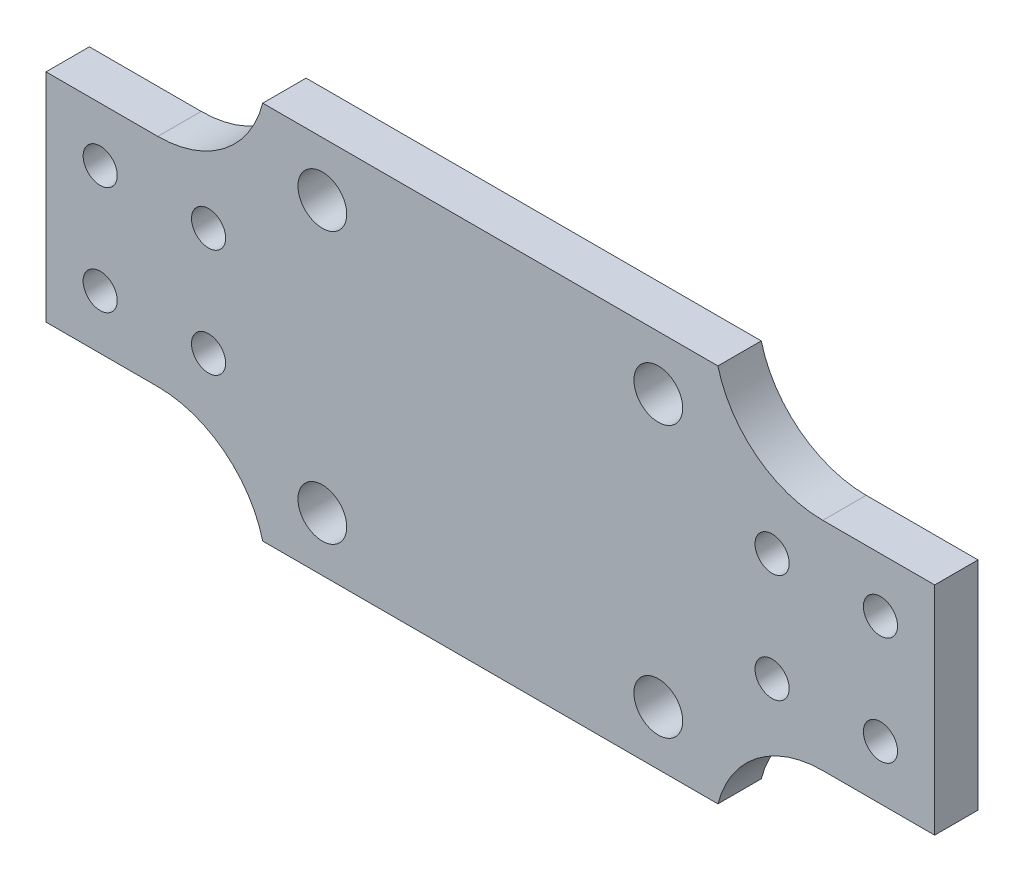
ISO-10303-21;
HEADER;
FILE_DESCRIPTION(('STEP AP214'),'2;1');
FILE_NAME('part.step','',(''),(''),'','','');
FILE_SCHEMA(('AUTOMOTIVE_DESIGN { 1 0 10303 214 1 1 1 1 }'));
ENDSEC;
DATA;
#1=APPLICATION_CONTEXT('core data for automotive mechanical design processes');
#2=APPLICATION_PROTOCOL_DEFINITION('international standard','automotive_design',2000,#1);
#3=PRODUCT_CONTEXT('',#1,'mechanical');
#4=PRODUCT('Part','Part','',(#3));
#5=PRODUCT_RELATED_PRODUCT_CATEGORY('part','',(#4));
#6=PRODUCT_DEFINITION_FORMATION('','',#4);
#7=PRODUCT_DEFINITION_CONTEXT('part definition',#1,'design');
#8=PRODUCT_DEFINITION('design','',#6,#7);
#9=PRODUCT_DEFINITION_SHAPE('','',#8);
#10=(LENGTH_UNIT() NAMED_UNIT(*) SI_UNIT(.MILLI.,.METRE.));
#11=(NAMED_UNIT(*) PLANE_ANGLE_UNIT() SI_UNIT($,.RADIAN.));
#12=(NAMED_UNIT(*) SI_UNIT($,.STERADIAN.) SOLID_ANGLE_UNIT());
#13=UNCERTAINTY_MEASURE_WITH_UNIT(LENGTH_MEASURE(1.E-05),#10,'distance_accuracy_value','');
#14=(GEOMETRIC_REPRESENTATION_CONTEXT(3) GLOBAL_UNCERTAINTY_ASSIGNED_CONTEXT((#13)) GLOBAL_UNIT_ASSIGNED_CONTEXT((#10,
#11,#12)) REPRESENTATION_CONTEXT('',''));
#15=CARTESIAN_POINT('',(0.,0.,0.));
#16=DIRECTION('',(0.,0.,1.));
#17=DIRECTION('',(1.,0.,0.));
#18=AXIS2_PLACEMENT_3D('',#15,#16,#17);
#19=CARTESIAN_POINT('',(0.,-20.,4.));
#20=DIRECTION('',(0.,1.,0.));
#21=DIRECTION('',(0.,0.,1.));
#22=AXIS2_PLACEMENT_3D('',#19,#20,#21);
#23=PLANE('',#22);
#24=DIRECTION('',(1.,0.,0.));
#25=VECTOR('',#24,1.);
#26=CARTESIAN_POINT('',(0.,-20.,0.));
#27=LINE('',#26,#25);
#28=CARTESIAN_POINT('',(0.,-20.,0.));
#29=VERTEX_POINT('',#28);
#30=CARTESIAN_POINT('',(10.3175416344815,-20.,0.));
#31=VERTEX_POINT('',#30);
#32=EDGE_CURVE('E194',#29,#31,#27,.T.);
#33=ORIENTED_EDGE('',*,*,#32,.T.);
#34=DIRECTION('',(0.,0.,1.));
#35=VECTOR('',#34,1.);
#36=CARTESIAN_POINT('',(10.3175416344815,-20.,4.));
#37=LINE('',#36,#35);
#38=CARTESIAN_POINT('',(10.3175416344815,-20.,4.));
#39=VERTEX_POINT('',#38);
#40=EDGE_CURVE('E223',#31,#39,#37,.T.);
#41=ORIENTED_EDGE('',*,*,#40,.T.);
#42=DIRECTION('',(1.,0.,0.));
#43=VECTOR('',#42,1.);
#44=CARTESIAN_POINT('',(0.,-20.,4.));
#45=LINE('',#44,#43);
#46=CARTESIAN_POINT('',(0.,-20.,4.));
#47=VERTEX_POINT('',#46);
#48=EDGE_CURVE('E138',#47,#39,#45,.T.);
#49=ORIENTED_EDGE('',*,*,#48,.F.);
#50=DIRECTION('',(0.,0.,-1.));
#51=VECTOR('',#50,1.);
#52=CARTESIAN_POINT('',(0.,-20.,4.));
#53=LINE('',#52,#51);
#54=EDGE_CURVE('E215',#47,#29,#53,.T.);
#55=ORIENTED_EDGE('',*,*,#54,.T.);
#56=EDGE_LOOP('',(#33,#41,#49,#55));
#57=FACE_BOUND('',#56,.T.);
#58=ADVANCED_FACE('F42',(#57),#23,.F.);
#59=CARTESIAN_POINT('',(0.,0.,4.));
#60=DIRECTION('',(0.,-1.,0.));
#61=DIRECTION('',(0.,0.,-1.));
#62=AXIS2_PLACEMENT_3D('',#59,#60,#61);
#63=PLANE('',#62);
#64=DIRECTION('',(-1.,0.,0.));
#65=VECTOR('',#64,1.);
#66=CARTESIAN_POINT('',(0.,0.,4.));
#67=LINE('',#66,#65);
#68=CARTESIAN_POINT('',(10.3175416344815,0.,4.));
#69=VERTEX_POINT('',#68);
#70=CARTESIAN_POINT('',(0.,0.,4.));
#71=VERTEX_POINT('',#70);
#72=EDGE_CURVE('E185',#69,#71,#67,.T.);
#73=ORIENTED_EDGE('',*,*,#72,.F.);
#74=DIRECTION('',(0.,0.,-1.));
#75=VECTOR('',#74,1.);
#76=CARTESIAN_POINT('',(10.3175416344815,0.,4.));
#77=LINE('',#76,#75);
#78=CARTESIAN_POINT('',(10.3175416344815,0.,0.));
#79=VERTEX_POINT('',#78);
#80=EDGE_CURVE('E226',#69,#79,#77,.T.);
#81=ORIENTED_EDGE('',*,*,#80,.T.);
#82=DIRECTION('',(-1.,0.,0.));
#83=VECTOR('',#82,1.);
#84=CARTESIAN_POINT('',(0.,0.,0.));
#85=LINE('',#84,#83);
#86=CARTESIAN_POINT('',(0.,0.,0.));
#87=VERTEX_POINT('',#86);
#88=EDGE_CURVE('E201',#79,#87,#85,.T.);
#89=ORIENTED_EDGE('',*,*,#88,.T.);
#90=DIRECTION('',(0.,0.,-1.));
#91=VECTOR('',#90,1.);
#92=CARTESIAN_POINT('',(0.,0.,4.));
#93=LINE('',#92,#91);
#94=EDGE_CURVE('E189',#71,#87,#93,.T.);
#95=ORIENTED_EDGE('',*,*,#94,.F.);
#96=EDGE_LOOP('',(#73,#81,#89,#95));
#97=FACE_BOUND('',#96,.T.);
#98=ADVANCED_FACE('F388',(#97),#63,.F.);
#99=CARTESIAN_POINT('',(0.,0.,4.));
#100=DIRECTION('',(1.,0.,0.));
#101=DIRECTION('',(0.,0.,-1.));
#102=AXIS2_PLACEMENT_3D('',#99,#100,#101);
#103=PLANE('',#102);
#104=DIRECTION('',(0.,-1.,0.));
#105=VECTOR('',#104,1.);
#106=CARTESIAN_POINT('',(0.,0.,0.));
#107=LINE('',#106,#105);
#108=EDGE_CURVE('E173',#87,#29,#107,.T.);
#109=ORIENTED_EDGE('',*,*,#108,.T.);
#110=ORIENTED_EDGE('',*,*,#54,.F.);
#111=DIRECTION('',(0.,-1.,0.));
#112=VECTOR('',#111,1.);
#113=CARTESIAN_POINT('',(0.,0.,4.));
#114=LINE('',#113,#112);
#115=EDGE_CURVE('E175',#71,#47,#114,.T.);
#116=ORIENTED_EDGE('',*,*,#115,.F.);
#117=ORIENTED_EDGE('',*,*,#94,.T.);
#118=EDGE_LOOP('',(#109,#110,#116,#117));
#119=FACE_BOUND('',#118,.T.);
#120=ADVANCED_FACE('F395',(#119),#103,.F.);
#121=CARTESIAN_POINT('',(71.6824583655186,-20.,4.));
#122=VERTEX_POINT('',#121);
#123=CARTESIAN_POINT('',(82.,-20.,4.));
#124=VERTEX_POINT('',#123);
#125=EDGE_CURVE('E178',#122,#124,#45,.T.);
#126=ORIENTED_EDGE('',*,*,#125,.F.);
#127=DIRECTION('',(0.,0.,-1.));
#128=VECTOR('',#127,1.);
#129=CARTESIAN_POINT('',(71.6824583655186,-20.,4.));
#130=LINE('',#129,#128);
#131=CARTESIAN_POINT('',(71.6824583655186,-20.,0.));
#132=VERTEX_POINT('',#131);
#133=EDGE_CURVE('E219',#122,#132,#130,.T.);
#134=ORIENTED_EDGE('',*,*,#133,.T.);
#135=CARTESIAN_POINT('',(82.,-20.,0.));
#136=VERTEX_POINT('',#135);
#137=EDGE_CURVE('E193',#132,#136,#27,.T.);
#138=ORIENTED_EDGE('',*,*,#137,.T.);
#139=DIRECTION('',(0.,0.,-1.));
#140=VECTOR('',#139,1.);
#141=CARTESIAN_POINT('',(82.,-20.,4.));
#142=LINE('',#141,#140);
#143=EDGE_CURVE('E211',#124,#136,#142,.T.);
#144=ORIENTED_EDGE('',*,*,#143,.F.);
#145=EDGE_LOOP('',(#126,#134,#138,#144));
#146=FACE_BOUND('',#145,.T.);
#147=ADVANCED_FACE('F391',(#146),#23,.F.);
#148=CARTESIAN_POINT('',(82.,0.,4.));
#149=DIRECTION('',(-1.,0.,0.));
#150=DIRECTION('',(0.,0.,1.));
#151=AXIS2_PLACEMENT_3D('',#148,#149,#150);
#152=PLANE('',#151);
#153=DIRECTION('',(0.,1.,0.));
#154=VECTOR('',#153,1.);
#155=CARTESIAN_POINT('',(82.,0.,0.));
#156=LINE('',#155,#154);
#157=CARTESIAN_POINT('',(82.,0.,0.));
#158=VERTEX_POINT('',#157);
#159=EDGE_CURVE('E198',#136,#158,#156,.T.);
#160=ORIENTED_EDGE('',*,*,#159,.T.);
#161=DIRECTION('',(0.,0.,-1.));
#162=VECTOR('',#161,1.);
#163=CARTESIAN_POINT('',(82.,0.,4.));
#164=LINE('',#163,#162);
#165=CARTESIAN_POINT('',(82.,0.,4.));
#166=VERTEX_POINT('',#165);
#167=EDGE_CURVE('E207',#166,#158,#164,.T.);
#168=ORIENTED_EDGE('',*,*,#167,.F.);
#169=DIRECTION('',(0.,1.,0.));
#170=VECTOR('',#169,1.);
#171=CARTESIAN_POINT('',(82.,0.,4.));
#172=LINE('',#171,#170);
#173=EDGE_CURVE('E182',#124,#166,#172,.T.);
#174=ORIENTED_EDGE('',*,*,#173,.F.);
#175=ORIENTED_EDGE('',*,*,#143,.T.);
#176=EDGE_LOOP('',(#160,#168,#174,#175));
#177=FACE_BOUND('',#176,.T.);
#178=ADVANCED_FACE('F401',(#177),#152,.F.);
#179=CARTESIAN_POINT('',(71.6824583655186,0.,0.));
#180=VERTEX_POINT('',#179);
#181=EDGE_CURVE('E179',#158,#180,#85,.T.);
#182=ORIENTED_EDGE('',*,*,#181,.T.);
#183=DIRECTION('',(0.,0.,1.));
#184=VECTOR('',#183,1.);
#185=CARTESIAN_POINT('',(71.6824583655186,0.,4.));
#186=LINE('',#185,#184);
#187=CARTESIAN_POINT('',(71.6824583655186,0.,4.));
#188=VERTEX_POINT('',#187);
#189=EDGE_CURVE('E230',#180,#188,#186,.T.);
#190=ORIENTED_EDGE('',*,*,#189,.T.);
#191=EDGE_CURVE('E186',#166,#188,#67,.T.);
#192=ORIENTED_EDGE('',*,*,#191,.F.);
#193=ORIENTED_EDGE('',*,*,#167,.T.);
#194=EDGE_LOOP('',(#182,#190,#192,#193));
#195=FACE_BOUND('',#194,.T.);
#196=ADVANCED_FACE('F362',(#195),#63,.F.);
#197=CARTESIAN_POINT('',(0.,0.,4.));
#198=DIRECTION('',(0.,0.,1.));
#199=DIRECTION('',(1.,0.,0.));
#200=AXIS2_PLACEMENT_3D('',#197,#198,#199);
#201=PLANE('',#200);
#202=CARTESIAN_POINT('',(67.,-15.,4.));
#203=DIRECTION('',(0.,0.,1.));
#204=DIRECTION('',(-1.,0.,0.));
#205=AXIS2_PLACEMENT_3D('',#202,#203,#204);
#206=CIRCLE('',#205,1.57500000000001);
#207=CARTESIAN_POINT('',(65.425,-15.,4.));
#208=VERTEX_POINT('',#207);
#209=EDGE_CURVE('E290',#208,#208,#206,.T.);
#210=ORIENTED_EDGE('',*,*,#209,.F.);
#211=EDGE_LOOP('',(#210));
#212=FACE_BOUND('',#211,.T.);
#213=CARTESIAN_POINT('',(67.,-5.00000000000002,4.));
#214=DIRECTION('',(0.,0.,1.));
#215=DIRECTION('',(1.,0.,0.));
#216=AXIS2_PLACEMENT_3D('',#213,#214,#215);
#217=CIRCLE('',#216,1.57500000000001);
#218=CARTESIAN_POINT('',(68.575,-5.00000000000002,4.));
#219=VERTEX_POINT('',#218);
#220=EDGE_CURVE('E305',#219,#219,#217,.T.);
#221=ORIENTED_EDGE('',*,*,#220,.F.);
#222=EDGE_LOOP('',(#221));
#223=FACE_BOUND('',#222,.T.);
#224=CARTESIAN_POINT('',(77.,-5.00000000000003,4.));
#225=DIRECTION('',(0.,0.,1.));
#226=DIRECTION('',(-1.,0.,0.));
#227=AXIS2_PLACEMENT_3D('',#224,#225,#226);
#228=CIRCLE('',#227,1.57499999999999);
#229=CARTESIAN_POINT('',(75.425,-5.00000000000003,4.));
#230=VERTEX_POINT('',#229);
#231=EDGE_CURVE('E306',#230,#230,#228,.T.);
#232=ORIENTED_EDGE('',*,*,#231,.F.);
#233=EDGE_LOOP('',(#232));
#234=FACE_BOUND('',#233,.T.);
#235=CARTESIAN_POINT('',(25.5,2.5,4.));
#236=DIRECTION('',(0.,0.,1.));
#237=DIRECTION('',(1.,0.,0.));
#238=AXIS2_PLACEMENT_3D('',#235,#236,#237);
#239=CIRCLE('',#238,2.25);
#240=CARTESIAN_POINT('',(27.75,2.5,4.));
#241=VERTEX_POINT('',#240);
#242=EDGE_CURVE('E321',#241,#241,#239,.T.);
#243=ORIENTED_EDGE('',*,*,#242,.F.);
#244=EDGE_LOOP('',(#243));
#245=FACE_BOUND('',#244,.T.);
#246=CARTESIAN_POINT('',(15.,-5.,4.));
#247=DIRECTION('',(0.,0.,1.));
#248=DIRECTION('',(-1.,0.,0.));
#249=AXIS2_PLACEMENT_3D('',#246,#247,#248);
#250=CIRCLE('',#249,1.575);
#251=CARTESIAN_POINT('',(13.425,-5.,4.));
#252=VERTEX_POINT('',#251);
#253=EDGE_CURVE('E265',#252,#252,#250,.T.);
#254=ORIENTED_EDGE('',*,*,#253,.F.);
#255=EDGE_LOOP('',(#254));
#256=FACE_BOUND('',#255,.T.);
#257=CARTESIAN_POINT('',(15.,-15.,4.));
#258=DIRECTION('',(0.,0.,1.));
#259=DIRECTION('',(1.,0.,0.));
#260=AXIS2_PLACEMENT_3D('',#257,#258,#259);
#261=CIRCLE('',#260,1.575);
#262=CARTESIAN_POINT('',(16.575,-15.,4.));
#263=VERTEX_POINT('',#262);
#264=EDGE_CURVE('E273',#263,#263,#261,.T.);
#265=ORIENTED_EDGE('',*,*,#264,.F.);
#266=EDGE_LOOP('',(#265));
#267=FACE_BOUND('',#266,.T.);
#268=CARTESIAN_POINT('',(5.,-15.,4.));
#269=DIRECTION('',(0.,0.,1.));
#270=DIRECTION('',(-1.,0.,0.));
#271=AXIS2_PLACEMENT_3D('',#268,#269,#270);
#272=CIRCLE('',#271,1.575);
#273=CARTESIAN_POINT('',(3.425,-15.,4.));
#274=VERTEX_POINT('',#273);
#275=EDGE_CURVE('E274',#274,#274,#272,.T.);
#276=ORIENTED_EDGE('',*,*,#275,.F.);
#277=EDGE_LOOP('',(#276));
#278=FACE_BOUND('',#277,.T.);
#279=CARTESIAN_POINT('',(77.,-15.,4.));
#280=DIRECTION('',(0.,0.,1.));
#281=DIRECTION('',(1.,0.,0.));
#282=AXIS2_PLACEMENT_3D('',#279,#280,#281);
#283=CIRCLE('',#282,1.57499999999999);
#284=CARTESIAN_POINT('',(78.575,-15.,4.));
#285=VERTEX_POINT('',#284);
#286=EDGE_CURVE('E289',#285,#285,#283,.T.);
#287=ORIENTED_EDGE('',*,*,#286,.F.);
#288=EDGE_LOOP('',(#287));
#289=FACE_BOUND('',#288,.T.);
#290=CARTESIAN_POINT('',(56.5,2.49999999999999,4.));
#291=DIRECTION('',(0.,0.,1.));
#292=DIRECTION('',(-1.,0.,0.));
#293=AXIS2_PLACEMENT_3D('',#290,#291,#292);
#294=CIRCLE('',#293,2.25000000000001);
#295=CARTESIAN_POINT('',(54.25,2.49999999999999,4.));
#296=VERTEX_POINT('',#295);
#297=EDGE_CURVE('E322',#296,#296,#294,.T.);
#298=ORIENTED_EDGE('',*,*,#297,.F.);
#299=EDGE_LOOP('',(#298));
#300=FACE_BOUND('',#299,.T.);
#301=CARTESIAN_POINT('',(56.5,-22.5,4.));
#302=DIRECTION('',(0.,0.,1.));
#303=DIRECTION('',(1.,0.,0.));
#304=AXIS2_PLACEMENT_3D('',#301,#302,#303);
#305=CIRCLE('',#304,2.25000000000001);
#306=CARTESIAN_POINT('',(58.75,-22.5,4.));
#307=VERTEX_POINT('',#306);
#308=EDGE_CURVE('E345',#307,#307,#305,.T.);
#309=ORIENTED_EDGE('',*,*,#308,.F.);
#310=EDGE_LOOP('',(#309));
#311=FACE_BOUND('',#310,.T.);
#312=CARTESIAN_POINT('',(25.5,-22.5,4.));
#313=DIRECTION('',(0.,0.,1.));
#314=DIRECTION('',(-1.,0.,0.));
#315=AXIS2_PLACEMENT_3D('',#312,#313,#314);
#316=CIRCLE('',#315,2.25);
#317=CARTESIAN_POINT('',(23.25,-22.5,4.));
#318=VERTEX_POINT('',#317);
#319=EDGE_CURVE('E337',#318,#318,#316,.T.);
#320=ORIENTED_EDGE('',*,*,#319,.F.);
#321=EDGE_LOOP('',(#320));
#322=FACE_BOUND('',#321,.T.);
#323=CARTESIAN_POINT('',(5.,-5.,4.));
#324=DIRECTION('',(0.,0.,1.));
#325=DIRECTION('',(1.,0.,0.));
#326=AXIS2_PLACEMENT_3D('',#323,#324,#325);
#327=CIRCLE('',#326,1.575);
#328=CARTESIAN_POINT('',(6.575,-5.,4.));
#329=VERTEX_POINT('',#328);
#330=EDGE_CURVE('E261',#329,#329,#327,.T.);
#331=ORIENTED_EDGE('',*,*,#330,.F.);
#332=EDGE_LOOP('',(#331));
#333=FACE_BOUND('',#332,.T.);
#334=ORIENTED_EDGE('',*,*,#191,.T.);
#335=CARTESIAN_POINT('',(71.6824583655186,10.,4.));
#336=DIRECTION('',(0.,0.,1.));
#337=DIRECTION('',(1.,0.,0.));
#338=AXIS2_PLACEMENT_3D('',#335,#336,#337);
#339=CIRCLE('',#338,10.);
#340=CARTESIAN_POINT('',(62.,7.5,4.));
#341=VERTEX_POINT('',#340);
#342=EDGE_CURVE('E51',#188,#341,#339,.F.);
#343=ORIENTED_EDGE('',*,*,#342,.T.);
#344=DIRECTION('',(-1.,0.,0.));
#345=VECTOR('',#344,1.);
#346=CARTESIAN_POINT('',(62.,7.5,4.));
#347=LINE('',#346,#345);
#348=CARTESIAN_POINT('',(20.,7.5,4.));
#349=VERTEX_POINT('',#348);
#350=EDGE_CURVE('E156',#341,#349,#347,.T.);
#351=ORIENTED_EDGE('',*,*,#350,.T.);
#352=CARTESIAN_POINT('',(10.3175416344815,10.,4.));
#353=DIRECTION('',(0.,0.,1.));
#354=DIRECTION('',(1.,0.,0.));
#355=AXIS2_PLACEMENT_3D('',#352,#353,#354);
#356=CIRCLE('',#355,10.);
#357=EDGE_CURVE('E243',#349,#69,#356,.F.);
#358=ORIENTED_EDGE('',*,*,#357,.T.);
#359=ORIENTED_EDGE('',*,*,#72,.T.);
#360=ORIENTED_EDGE('',*,*,#115,.T.);
#361=ORIENTED_EDGE('',*,*,#48,.T.);
#362=CARTESIAN_POINT('',(10.3175416344815,-30.,4.));
#363=DIRECTION('',(0.,0.,1.));
#364=DIRECTION('',(1.,0.,0.));
#365=AXIS2_PLACEMENT_3D('',#362,#363,#364);
#366=CIRCLE('',#365,10.);
#367=CARTESIAN_POINT('',(20.,-27.5,4.));
#368=VERTEX_POINT('',#367);
#369=EDGE_CURVE('E131',#39,#368,#366,.F.);
#370=ORIENTED_EDGE('',*,*,#369,.T.);
#371=DIRECTION('',(1.,0.,0.));
#372=VECTOR('',#371,1.);
#373=CARTESIAN_POINT('',(62.,-27.5,4.));
#374=LINE('',#373,#372);
#375=CARTESIAN_POINT('',(62.,-27.5,4.));
#376=VERTEX_POINT('',#375);
#377=EDGE_CURVE('E135',#368,#376,#374,.T.);
#378=ORIENTED_EDGE('',*,*,#377,.T.);
#379=CARTESIAN_POINT('',(71.6824583655186,-30.,4.));
#380=DIRECTION('',(0.,0.,1.));
#381=DIRECTION('',(1.,0.,0.));
#382=AXIS2_PLACEMENT_3D('',#379,#380,#381);
#383=CIRCLE('',#382,10.);
#384=EDGE_CURVE('E145',#376,#122,#383,.F.);
#385=ORIENTED_EDGE('',*,*,#384,.T.);
#386=ORIENTED_EDGE('',*,*,#125,.T.);
#387=ORIENTED_EDGE('',*,*,#173,.T.);
#388=EDGE_LOOP('',(#334,#343,#351,#358,#359,#360,#361,#370,#378,#385,#386,#387));
#389=FACE_BOUND('',#388,.T.);
#390=ADVANCED_FACE('F134',(#212,#223,#234,#245,#256,#267,#278,#289,#300,#311,#322,#333,#389),
#201,.T.);
#391=CARTESIAN_POINT('',(0.,0.,0.));
#392=DIRECTION('',(0.,0.,1.));
#393=DIRECTION('',(1.,0.,0.));
#394=AXIS2_PLACEMENT_3D('',#391,#392,#393);
#395=PLANE('',#394);
#396=CARTESIAN_POINT('',(67.,-15.,0.));
#397=DIRECTION('',(0.,0.,1.));
#398=DIRECTION('',(-1.,0.,0.));
#399=AXIS2_PLACEMENT_3D('',#396,#397,#398);
#400=CIRCLE('',#399,1.57500000000001);
#401=CARTESIAN_POINT('',(65.425,-15.,0.));
#402=VERTEX_POINT('',#401);
#403=EDGE_CURVE('E310',#402,#402,#400,.T.);
#404=ORIENTED_EDGE('',*,*,#403,.T.);
#405=EDGE_LOOP('',(#404));
#406=FACE_BOUND('',#405,.T.);
#407=CARTESIAN_POINT('',(67.,-5.00000000000002,0.));
#408=DIRECTION('',(0.,0.,1.));
#409=DIRECTION('',(1.,0.,0.));
#410=AXIS2_PLACEMENT_3D('',#407,#408,#409);
#411=CIRCLE('',#410,1.57500000000001);
#412=CARTESIAN_POINT('',(68.575,-5.00000000000002,0.));
#413=VERTEX_POINT('',#412);
#414=EDGE_CURVE('E301',#413,#413,#411,.T.);
#415=ORIENTED_EDGE('',*,*,#414,.T.);
#416=EDGE_LOOP('',(#415));
#417=FACE_BOUND('',#416,.T.);
#418=CARTESIAN_POINT('',(77.,-5.00000000000003,0.));
#419=DIRECTION('',(0.,0.,1.));
#420=DIRECTION('',(-1.,0.,0.));
#421=AXIS2_PLACEMENT_3D('',#418,#419,#420);
#422=CIRCLE('',#421,1.57499999999999);
#423=CARTESIAN_POINT('',(75.425,-5.00000000000003,0.));
#424=VERTEX_POINT('',#423);
#425=EDGE_CURVE('E326',#424,#424,#422,.T.);
#426=ORIENTED_EDGE('',*,*,#425,.T.);
#427=EDGE_LOOP('',(#426));
#428=FACE_BOUND('',#427,.T.);
#429=CARTESIAN_POINT('',(25.5,2.5,0.));
#430=DIRECTION('',(0.,0.,1.));
#431=DIRECTION('',(1.,0.,0.));
#432=AXIS2_PLACEMENT_3D('',#429,#430,#431);
#433=CIRCLE('',#432,2.25);
#434=CARTESIAN_POINT('',(27.75,2.5,0.));
#435=VERTEX_POINT('',#434);
#436=EDGE_CURVE('E317',#435,#435,#433,.T.);
#437=ORIENTED_EDGE('',*,*,#436,.T.);
#438=EDGE_LOOP('',(#437));
#439=FACE_BOUND('',#438,.T.);
#440=CARTESIAN_POINT('',(15.,-5.,0.));
#441=DIRECTION('',(0.,0.,1.));
#442=DIRECTION('',(-1.,0.,0.));
#443=AXIS2_PLACEMENT_3D('',#440,#441,#442);
#444=CIRCLE('',#443,1.575);
#445=CARTESIAN_POINT('',(13.425,-5.,0.));
#446=VERTEX_POINT('',#445);
#447=EDGE_CURVE('E278',#446,#446,#444,.T.);
#448=ORIENTED_EDGE('',*,*,#447,.T.);
#449=EDGE_LOOP('',(#448));
#450=FACE_BOUND('',#449,.T.);
#451=CARTESIAN_POINT('',(15.,-15.,0.));
#452=DIRECTION('',(0.,0.,1.));
#453=DIRECTION('',(1.,0.,0.));
#454=AXIS2_PLACEMENT_3D('',#451,#452,#453);
#455=CIRCLE('',#454,1.575);
#456=CARTESIAN_POINT('',(16.575,-15.,0.));
#457=VERTEX_POINT('',#456);
#458=EDGE_CURVE('E269',#457,#457,#455,.T.);
#459=ORIENTED_EDGE('',*,*,#458,.T.);
#460=EDGE_LOOP('',(#459));
#461=FACE_BOUND('',#460,.T.);
#462=CARTESIAN_POINT('',(5.,-15.,0.));
#463=DIRECTION('',(0.,0.,1.));
#464=DIRECTION('',(-1.,0.,0.));
#465=AXIS2_PLACEMENT_3D('',#462,#463,#464);
#466=CIRCLE('',#465,1.575);
#467=CARTESIAN_POINT('',(3.425,-15.,0.));
#468=VERTEX_POINT('',#467);
#469=EDGE_CURVE('E294',#468,#468,#466,.T.);
#470=ORIENTED_EDGE('',*,*,#469,.T.);
#471=EDGE_LOOP('',(#470));
#472=FACE_BOUND('',#471,.T.);
#473=CARTESIAN_POINT('',(77.,-15.,0.));
#474=DIRECTION('',(0.,0.,1.));
#475=DIRECTION('',(1.,0.,0.));
#476=AXIS2_PLACEMENT_3D('',#473,#474,#475);
#477=CIRCLE('',#476,1.57499999999999);
#478=CARTESIAN_POINT('',(78.575,-15.,0.));
#479=VERTEX_POINT('',#478);
#480=EDGE_CURVE('E285',#479,#479,#477,.T.);
#481=ORIENTED_EDGE('',*,*,#480,.T.);
#482=EDGE_LOOP('',(#481));
#483=FACE_BOUND('',#482,.T.);
#484=CARTESIAN_POINT('',(56.5,2.49999999999999,0.));
#485=DIRECTION('',(0.,0.,1.));
#486=DIRECTION('',(-1.,0.,0.));
#487=AXIS2_PLACEMENT_3D('',#484,#485,#486);
#488=CIRCLE('',#487,2.25000000000001);
#489=CARTESIAN_POINT('',(54.25,2.49999999999999,0.));
#490=VERTEX_POINT('',#489);
#491=EDGE_CURVE('E349',#490,#490,#488,.T.);
#492=ORIENTED_EDGE('',*,*,#491,.T.);
#493=EDGE_LOOP('',(#492));
#494=FACE_BOUND('',#493,.T.);
#495=CARTESIAN_POINT('',(56.5,-22.5,0.));
#496=DIRECTION('',(0.,0.,1.));
#497=DIRECTION('',(1.,0.,0.));
#498=AXIS2_PLACEMENT_3D('',#495,#496,#497);
#499=CIRCLE('',#498,2.25000000000001);
#500=CARTESIAN_POINT('',(58.75,-22.5,0.));
#501=VERTEX_POINT('',#500);
#502=EDGE_CURVE('E341',#501,#501,#499,.T.);
#503=ORIENTED_EDGE('',*,*,#502,.T.);
#504=EDGE_LOOP('',(#503));
#505=FACE_BOUND('',#504,.T.);
#506=CARTESIAN_POINT('',(25.5,-22.5,0.));
#507=DIRECTION('',(0.,0.,1.));
#508=DIRECTION('',(-1.,0.,0.));
#509=AXIS2_PLACEMENT_3D('',#506,#507,#508);
#510=CIRCLE('',#509,2.25);
#511=CARTESIAN_POINT('',(23.25,-22.5,0.));
#512=VERTEX_POINT('',#511);
#513=EDGE_CURVE('E333',#512,#512,#510,.T.);
#514=ORIENTED_EDGE('',*,*,#513,.T.);
#515=EDGE_LOOP('',(#514));
#516=FACE_BOUND('',#515,.T.);
#517=CARTESIAN_POINT('',(5.,-5.,0.));
#518=DIRECTION('',(0.,0.,1.));
#519=DIRECTION('',(1.,0.,0.));
#520=AXIS2_PLACEMENT_3D('',#517,#518,#519);
#521=CIRCLE('',#520,1.575);
#522=CARTESIAN_POINT('',(6.575,-5.,0.));
#523=VERTEX_POINT('',#522);
#524=EDGE_CURVE('E157',#523,#523,#521,.T.);
#525=ORIENTED_EDGE('',*,*,#524,.T.);
#526=EDGE_LOOP('',(#525));
#527=FACE_BOUND('',#526,.T.);
#528=ORIENTED_EDGE('',*,*,#137,.F.);
#529=CARTESIAN_POINT('',(71.6824583655186,-30.,0.));
#530=DIRECTION('',(0.,0.,1.));
#531=DIRECTION('',(1.,0.,0.));
#532=AXIS2_PLACEMENT_3D('',#529,#530,#531);
#533=CIRCLE('',#532,10.);
#534=CARTESIAN_POINT('',(62.,-27.5,0.));
#535=VERTEX_POINT('',#534);
#536=EDGE_CURVE('E233',#132,#535,#533,.T.);
#537=ORIENTED_EDGE('',*,*,#536,.T.);
#538=DIRECTION('',(-1.,0.,0.));
#539=VECTOR('',#538,1.);
#540=CARTESIAN_POINT('',(62.,-27.5,0.));
#541=LINE('',#540,#539);
#542=CARTESIAN_POINT('',(20.,-27.5,0.));
#543=VERTEX_POINT('',#542);
#544=EDGE_CURVE('E170',#535,#543,#541,.T.);
#545=ORIENTED_EDGE('',*,*,#544,.T.);
#546=CARTESIAN_POINT('',(10.3175416344815,-30.,0.));
#547=DIRECTION('',(0.,0.,1.));
#548=DIRECTION('',(1.,0.,0.));
#549=AXIS2_PLACEMENT_3D('',#546,#547,#548);
#550=CIRCLE('',#549,10.);
#551=EDGE_CURVE('E144',#543,#31,#550,.T.);
#552=ORIENTED_EDGE('',*,*,#551,.T.);
#553=ORIENTED_EDGE('',*,*,#32,.F.);
#554=ORIENTED_EDGE('',*,*,#108,.F.);
#555=ORIENTED_EDGE('',*,*,#88,.F.);
#556=CARTESIAN_POINT('',(10.3175416344815,10.,0.));
#557=DIRECTION('',(0.,0.,1.));
#558=DIRECTION('',(1.,0.,0.));
#559=AXIS2_PLACEMENT_3D('',#556,#557,#558);
#560=CIRCLE('',#559,10.);
#561=CARTESIAN_POINT('',(20.,7.5,0.));
#562=VERTEX_POINT('',#561);
#563=EDGE_CURVE('E240',#79,#562,#560,.T.);
#564=ORIENTED_EDGE('',*,*,#563,.T.);
#565=DIRECTION('',(1.,0.,0.));
#566=VECTOR('',#565,1.);
#567=CARTESIAN_POINT('',(62.,7.5,0.));
#568=LINE('',#567,#566);
#569=CARTESIAN_POINT('',(62.,7.5,0.));
#570=VERTEX_POINT('',#569);
#571=EDGE_CURVE('E174',#562,#570,#568,.T.);
#572=ORIENTED_EDGE('',*,*,#571,.T.);
#573=CARTESIAN_POINT('',(71.6824583655186,10.,0.));
#574=DIRECTION('',(0.,0.,1.));
#575=DIRECTION('',(1.,0.,0.));
#576=AXIS2_PLACEMENT_3D('',#573,#574,#575);
#577=CIRCLE('',#576,10.);
#578=EDGE_CURVE('E11',#570,#180,#577,.T.);
#579=ORIENTED_EDGE('',*,*,#578,.T.);
#580=ORIENTED_EDGE('',*,*,#181,.F.);
#581=ORIENTED_EDGE('',*,*,#159,.F.);
#582=EDGE_LOOP('',(#528,#537,#545,#552,#553,#554,#555,#564,#572,#579,#580,#581));
#583=FACE_BOUND('',#582,.T.);
#584=ADVANCED_FACE('F361',(#406,#417,#428,#439,#450,#461,#472,#483,#494,#505,#516,#527,#583),
#395,.F.);
#585=CARTESIAN_POINT('',(62.,7.5,-54.6717477313466));
#586=DIRECTION('',(0.,1.,0.));
#587=DIRECTION('',(-1.,0.,0.));
#588=AXIS2_PLACEMENT_3D('',#585,#586,#587);
#589=PLANE('',#588);
#590=ORIENTED_EDGE('',*,*,#571,.F.);
#591=DIRECTION('',(0.,0.,1.));
#592=VECTOR('',#591,1.);
#593=CARTESIAN_POINT('',(20.,7.5,-54.6717477313466));
#594=LINE('',#593,#592);
#595=EDGE_CURVE('E254',#562,#349,#594,.T.);
#596=ORIENTED_EDGE('',*,*,#595,.T.);
#597=ORIENTED_EDGE('',*,*,#350,.F.);
#598=DIRECTION('',(0.,0.,1.));
#599=VECTOR('',#598,1.);
#600=CARTESIAN_POINT('',(62.,7.5,-54.6717477313466));
#601=LINE('',#600,#599);
#602=EDGE_CURVE('E164',#570,#341,#601,.T.);
#603=ORIENTED_EDGE('',*,*,#602,.F.);
#604=EDGE_LOOP('',(#590,#596,#597,#603));
#605=FACE_BOUND('',#604,.T.);
#606=ADVANCED_FACE('F252',(#605),#589,.T.);
#607=CARTESIAN_POINT('',(62.,-27.5,-54.6717477313466));
#608=DIRECTION('',(0.,-1.,0.));
#609=DIRECTION('',(1.,0.,0.));
#610=AXIS2_PLACEMENT_3D('',#607,#608,#609);
#611=PLANE('',#610);
#612=ORIENTED_EDGE('',*,*,#544,.F.);
#613=DIRECTION('',(0.,0.,1.));
#614=VECTOR('',#613,1.);
#615=CARTESIAN_POINT('',(62.,-27.5,-54.6717477313466));
#616=LINE('',#615,#614);
#617=EDGE_CURVE('E154',#535,#376,#616,.T.);
#618=ORIENTED_EDGE('',*,*,#617,.T.);
#619=ORIENTED_EDGE('',*,*,#377,.F.);
#620=DIRECTION('',(0.,0.,1.));
#621=VECTOR('',#620,1.);
#622=CARTESIAN_POINT('',(20.,-27.5,-54.6717477313466));
#623=LINE('',#622,#621);
#624=EDGE_CURVE('E151',#543,#368,#623,.T.);
#625=ORIENTED_EDGE('',*,*,#624,.F.);
#626=EDGE_LOOP('',(#612,#618,#619,#625));
#627=FACE_BOUND('',#626,.T.);
#628=ADVANCED_FACE('F150',(#627),#611,.T.);
#629=CARTESIAN_POINT('',(5.,-5.,0.));
#630=DIRECTION('',(0.,0.,1.));
#631=DIRECTION('',(1.,0.,0.));
#632=AXIS2_PLACEMENT_3D('',#629,#630,#631);
#633=CYLINDRICAL_SURFACE('',#632,1.575);
#634=ORIENTED_EDGE('',*,*,#524,.F.);
#635=EDGE_LOOP('',(#634));
#636=FACE_BOUND('',#635,.T.);
#637=ORIENTED_EDGE('',*,*,#330,.T.);
#638=EDGE_LOOP('',(#637));
#639=FACE_BOUND('',#638,.T.);
#640=ADVANCED_FACE('F371',(#636,#639),#633,.F.);
#641=CARTESIAN_POINT('',(25.5,-22.5,0.));
#642=DIRECTION('',(0.,0.,1.));
#643=DIRECTION('',(1.,0.,0.));
#644=AXIS2_PLACEMENT_3D('',#641,#642,#643);
#645=CYLINDRICAL_SURFACE('',#644,2.25);
#646=ORIENTED_EDGE('',*,*,#513,.F.);
#647=EDGE_LOOP('',(#646));
#648=FACE_BOUND('',#647,.T.);
#649=ORIENTED_EDGE('',*,*,#319,.T.);
#650=EDGE_LOOP('',(#649));
#651=FACE_BOUND('',#650,.T.);
#652=ADVANCED_FACE('F373',(#648,#651),#645,.F.);
#653=CARTESIAN_POINT('',(56.5,-22.5,0.));
#654=DIRECTION('',(0.,0.,1.));
#655=DIRECTION('',(1.,0.,0.));
#656=AXIS2_PLACEMENT_3D('',#653,#654,#655);
#657=CYLINDRICAL_SURFACE('',#656,2.25000000000001);
#658=ORIENTED_EDGE('',*,*,#502,.F.);
#659=EDGE_LOOP('',(#658));
#660=FACE_BOUND('',#659,.T.);
#661=ORIENTED_EDGE('',*,*,#308,.T.);
#662=EDGE_LOOP('',(#661));
#663=FACE_BOUND('',#662,.T.);
#664=ADVANCED_FACE('F380',(#660,#663),#657,.F.);
#665=CARTESIAN_POINT('',(56.5,2.49999999999999,0.));
#666=DIRECTION('',(0.,0.,1.));
#667=DIRECTION('',(1.,0.,0.));
#668=AXIS2_PLACEMENT_3D('',#665,#666,#667);
#669=CYLINDRICAL_SURFACE('',#668,2.25000000000001);
#670=ORIENTED_EDGE('',*,*,#491,.F.);
#671=EDGE_LOOP('',(#670));
#672=FACE_BOUND('',#671,.T.);
#673=ORIENTED_EDGE('',*,*,#297,.T.);
#674=EDGE_LOOP('',(#673));
#675=FACE_BOUND('',#674,.T.);
#676=ADVANCED_FACE('F357',(#672,#675),#669,.F.);
#677=CARTESIAN_POINT('',(77.,-15.,0.));
#678=DIRECTION('',(0.,0.,1.));
#679=DIRECTION('',(1.,0.,0.));
#680=AXIS2_PLACEMENT_3D('',#677,#678,#679);
#681=CYLINDRICAL_SURFACE('',#680,1.57499999999999);
#682=ORIENTED_EDGE('',*,*,#480,.F.);
#683=EDGE_LOOP('',(#682));
#684=FACE_BOUND('',#683,.T.);
#685=ORIENTED_EDGE('',*,*,#286,.T.);
#686=EDGE_LOOP('',(#685));
#687=FACE_BOUND('',#686,.T.);
#688=ADVANCED_FACE('F461',(#684,#687),#681,.F.);
#689=CARTESIAN_POINT('',(5.,-15.,0.));
#690=DIRECTION('',(0.,0.,1.));
#691=DIRECTION('',(1.,0.,0.));
#692=AXIS2_PLACEMENT_3D('',#689,#690,#691);
#693=CYLINDRICAL_SURFACE('',#692,1.575);
#694=ORIENTED_EDGE('',*,*,#469,.F.);
#695=EDGE_LOOP('',(#694));
#696=FACE_BOUND('',#695,.T.);
#697=ORIENTED_EDGE('',*,*,#275,.T.);
#698=EDGE_LOOP('',(#697));
#699=FACE_BOUND('',#698,.T.);
#700=ADVANCED_FACE('F457',(#696,#699),#693,.F.);
#701=CARTESIAN_POINT('',(15.,-15.,0.));
#702=DIRECTION('',(0.,0.,1.));
#703=DIRECTION('',(1.,0.,0.));
#704=AXIS2_PLACEMENT_3D('',#701,#702,#703);
#705=CYLINDRICAL_SURFACE('',#704,1.575);
#706=ORIENTED_EDGE('',*,*,#458,.F.);
#707=EDGE_LOOP('',(#706));
#708=FACE_BOUND('',#707,.T.);
#709=ORIENTED_EDGE('',*,*,#264,.T.);
#710=EDGE_LOOP('',(#709));
#711=FACE_BOUND('',#710,.T.);
#712=ADVANCED_FACE('F460',(#708,#711),#705,.F.);
#713=CARTESIAN_POINT('',(15.,-5.,0.));
#714=DIRECTION('',(0.,0.,1.));
#715=DIRECTION('',(1.,0.,0.));
#716=AXIS2_PLACEMENT_3D('',#713,#714,#715);
#717=CYLINDRICAL_SURFACE('',#716,1.575);
#718=ORIENTED_EDGE('',*,*,#447,.F.);
#719=EDGE_LOOP('',(#718));
#720=FACE_BOUND('',#719,.T.);
#721=ORIENTED_EDGE('',*,*,#253,.T.);
#722=EDGE_LOOP('',(#721));
#723=FACE_BOUND('',#722,.T.);
#724=ADVANCED_FACE('F466',(#720,#723),#717,.F.);
#725=CARTESIAN_POINT('',(25.5,2.5,0.));
#726=DIRECTION('',(0.,0.,1.));
#727=DIRECTION('',(1.,0.,0.));
#728=AXIS2_PLACEMENT_3D('',#725,#726,#727);
#729=CYLINDRICAL_SURFACE('',#728,2.25);
#730=ORIENTED_EDGE('',*,*,#436,.F.);
#731=EDGE_LOOP('',(#730));
#732=FACE_BOUND('',#731,.T.);
#733=ORIENTED_EDGE('',*,*,#242,.T.);
#734=EDGE_LOOP('',(#733));
#735=FACE_BOUND('',#734,.T.);
#736=ADVANCED_FACE('F454',(#732,#735),#729,.F.);
#737=CARTESIAN_POINT('',(77.,-5.00000000000003,0.));
#738=DIRECTION('',(0.,0.,1.));
#739=DIRECTION('',(1.,0.,0.));
#740=AXIS2_PLACEMENT_3D('',#737,#738,#739);
#741=CYLINDRICAL_SURFACE('',#740,1.57499999999999);
#742=ORIENTED_EDGE('',*,*,#425,.F.);
#743=EDGE_LOOP('',(#742));
#744=FACE_BOUND('',#743,.T.);
#745=ORIENTED_EDGE('',*,*,#231,.T.);
#746=EDGE_LOOP('',(#745));
#747=FACE_BOUND('',#746,.T.);
#748=ADVANCED_FACE('F448',(#744,#747),#741,.F.);
#749=CARTESIAN_POINT('',(67.,-5.00000000000002,0.));
#750=DIRECTION('',(0.,0.,1.));
#751=DIRECTION('',(1.,0.,0.));
#752=AXIS2_PLACEMENT_3D('',#749,#750,#751);
#753=CYLINDRICAL_SURFACE('',#752,1.57500000000001);
#754=ORIENTED_EDGE('',*,*,#414,.F.);
#755=EDGE_LOOP('',(#754));
#756=FACE_BOUND('',#755,.T.);
#757=ORIENTED_EDGE('',*,*,#220,.T.);
#758=EDGE_LOOP('',(#757));
#759=FACE_BOUND('',#758,.T.);
#760=ADVANCED_FACE('F442',(#756,#759),#753,.F.);
#761=CARTESIAN_POINT('',(67.,-15.,0.));
#762=DIRECTION('',(0.,0.,1.));
#763=DIRECTION('',(1.,0.,0.));
#764=AXIS2_PLACEMENT_3D('',#761,#762,#763);
#765=CYLINDRICAL_SURFACE('',#764,1.57500000000001);
#766=ORIENTED_EDGE('',*,*,#403,.F.);
#767=EDGE_LOOP('',(#766));
#768=FACE_BOUND('',#767,.T.);
#769=ORIENTED_EDGE('',*,*,#209,.T.);
#770=EDGE_LOOP('',(#769));
#771=FACE_BOUND('',#770,.T.);
#772=ADVANCED_FACE('F438',(#768,#771),#765,.F.);
#773=CARTESIAN_POINT('',(71.6824583655186,-30.,-54.6717477313466));
#774=DIRECTION('',(0.,0.,-1.));
#775=DIRECTION('',(-1.,0.,0.));
#776=AXIS2_PLACEMENT_3D('',#773,#774,#775);
#777=CYLINDRICAL_SURFACE('',#776,10.);
#778=ORIENTED_EDGE('',*,*,#384,.F.);
#779=ORIENTED_EDGE('',*,*,#617,.F.);
#780=ORIENTED_EDGE('',*,*,#536,.F.);
#781=ORIENTED_EDGE('',*,*,#133,.F.);
#782=EDGE_LOOP('',(#778,#779,#780,#781));
#783=FACE_BOUND('',#782,.T.);
#784=ADVANCED_FACE('F416',(#783),#777,.F.);
#785=CARTESIAN_POINT('',(10.3175416344815,-30.,-54.6717477313466));
#786=DIRECTION('',(0.,0.,1.));
#787=DIRECTION('',(1.,0.,0.));
#788=AXIS2_PLACEMENT_3D('',#785,#786,#787);
#789=CYLINDRICAL_SURFACE('',#788,10.);
#790=ORIENTED_EDGE('',*,*,#551,.F.);
#791=ORIENTED_EDGE('',*,*,#624,.T.);
#792=ORIENTED_EDGE('',*,*,#369,.F.);
#793=ORIENTED_EDGE('',*,*,#40,.F.);
#794=EDGE_LOOP('',(#790,#791,#792,#793));
#795=FACE_BOUND('',#794,.T.);
#796=ADVANCED_FACE('F159',(#795),#789,.F.);
#797=CARTESIAN_POINT('',(10.3175416344815,10.,-54.6717477313466));
#798=DIRECTION('',(0.,0.,-1.));
#799=DIRECTION('',(-1.,0.,0.));
#800=AXIS2_PLACEMENT_3D('',#797,#798,#799);
#801=CYLINDRICAL_SURFACE('',#800,10.);
#802=ORIENTED_EDGE('',*,*,#357,.F.);
#803=ORIENTED_EDGE('',*,*,#595,.F.);
#804=ORIENTED_EDGE('',*,*,#563,.F.);
#805=ORIENTED_EDGE('',*,*,#80,.F.);
#806=EDGE_LOOP('',(#802,#803,#804,#805));
#807=FACE_BOUND('',#806,.T.);
#808=ADVANCED_FACE('F429',(#807),#801,.F.);
#809=CARTESIAN_POINT('',(71.6824583655186,10.,-54.6717477313466));
#810=DIRECTION('',(0.,0.,1.));
#811=DIRECTION('',(1.,0.,0.));
#812=AXIS2_PLACEMENT_3D('',#809,#810,#811);
#813=CYLINDRICAL_SURFACE('',#812,10.);
#814=ORIENTED_EDGE('',*,*,#578,.F.);
#815=ORIENTED_EDGE('',*,*,#602,.T.);
#816=ORIENTED_EDGE('',*,*,#342,.F.);
#817=ORIENTED_EDGE('',*,*,#189,.F.);
#818=EDGE_LOOP('',(#814,#815,#816,#817));
#819=FACE_BOUND('',#818,.T.);
#820=ADVANCED_FACE('F44',(#819),#813,.F.);
#821=CLOSED_SHELL('',(#58,#98,#120,#147,#178,#196,#390,#584,#606,#628,#640,#652,#664,#676,#688,
#700,#712,#724,#736,#748,#760,#772,#784,#796,#808,#820));
#822=MANIFOLD_SOLID_BREP('B2',#821);
#823=ADVANCED_BREP_SHAPE_REPRESENTATION('',(#18,#822),#14);
#824=SHAPE_DEFINITION_REPRESENTATION(#9,#823);
ENDSEC;
END-ISO-10303-21;
